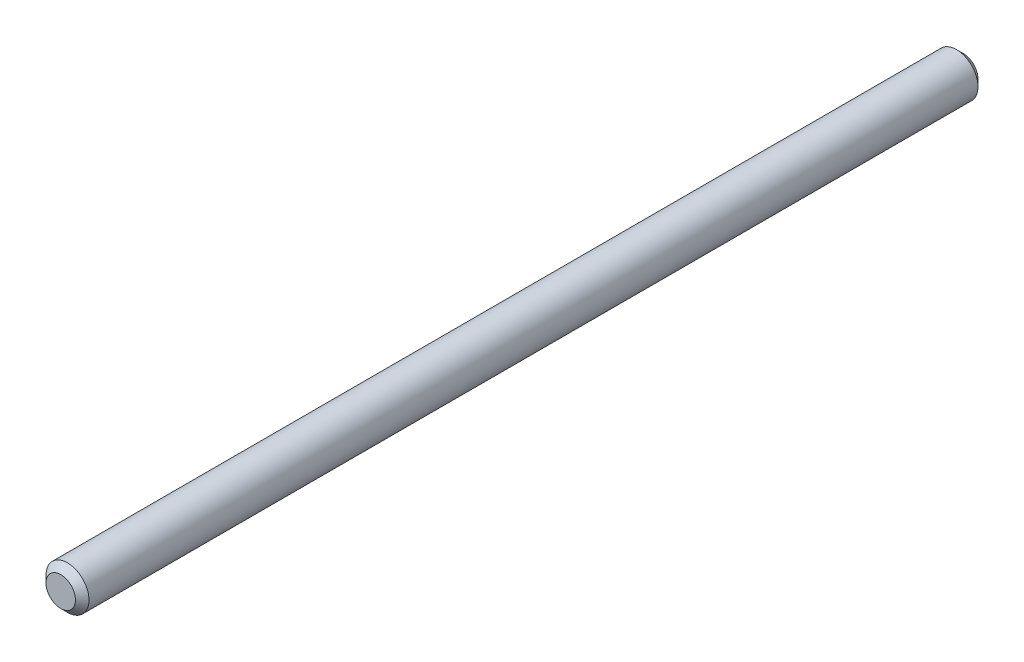
ISO-10303-21;
HEADER;
FILE_DESCRIPTION(('STEP AP214'),'2;1');
FILE_NAME('part.step','',(''),(''),'','','');
FILE_SCHEMA(('AUTOMOTIVE_DESIGN { 1 0 10303 214 1 1 1 1 }'));
ENDSEC;
DATA;
#1=APPLICATION_CONTEXT('core data for automotive mechanical design processes');
#2=APPLICATION_PROTOCOL_DEFINITION('international standard','automotive_design',2000,#1);
#3=PRODUCT_CONTEXT('',#1,'mechanical');
#4=PRODUCT('Part','Part','',(#3));
#5=PRODUCT_RELATED_PRODUCT_CATEGORY('part','',(#4));
#6=PRODUCT_DEFINITION_FORMATION('','',#4);
#7=PRODUCT_DEFINITION_CONTEXT('part definition',#1,'design');
#8=PRODUCT_DEFINITION('design','',#6,#7);
#9=PRODUCT_DEFINITION_SHAPE('','',#8);
#10=(LENGTH_UNIT() NAMED_UNIT(*) SI_UNIT(.MILLI.,.METRE.));
#11=(NAMED_UNIT(*) PLANE_ANGLE_UNIT() SI_UNIT($,.RADIAN.));
#12=(NAMED_UNIT(*) SI_UNIT($,.STERADIAN.) SOLID_ANGLE_UNIT());
#13=UNCERTAINTY_MEASURE_WITH_UNIT(LENGTH_MEASURE(1.E-05),#10,'distance_accuracy_value','');
#14=(GEOMETRIC_REPRESENTATION_CONTEXT(3) GLOBAL_UNCERTAINTY_ASSIGNED_CONTEXT((#13)) GLOBAL_UNIT_ASSIGNED_CONTEXT((#10,
#11,#12)) REPRESENTATION_CONTEXT('',''));
#15=CARTESIAN_POINT('',(0.,0.,0.));
#16=DIRECTION('',(0.,0.,1.));
#17=DIRECTION('',(1.,0.,0.));
#18=AXIS2_PLACEMENT_3D('',#15,#16,#17);
#19=CARTESIAN_POINT('',(0.,0.,100.));
#20=DIRECTION('',(0.,0.,-1.));
#21=DIRECTION('',(-1.,0.,0.));
#22=AXIS2_PLACEMENT_3D('',#19,#20,#21);
#23=CYLINDRICAL_SURFACE('',#22,4.7625);
#24=CARTESIAN_POINT('',(0.,0.,-98.5));
#25=DIRECTION('',(0.,0.,1.));
#26=DIRECTION('',(1.,0.,0.));
#27=AXIS2_PLACEMENT_3D('',#24,#25,#26);
#28=CIRCLE('',#27,4.7625);
#29=CARTESIAN_POINT('',(4.7625,0.,-98.5));
#30=VERTEX_POINT('',#29);
#31=EDGE_CURVE('E48',#30,#30,#28,.T.);
#32=ORIENTED_EDGE('',*,*,#31,.T.);
#33=EDGE_LOOP('',(#32));
#34=FACE_BOUND('',#33,.T.);
#35=CARTESIAN_POINT('',(0.,0.,98.5));
#36=DIRECTION('',(0.,0.,1.));
#37=DIRECTION('',(1.,0.,0.));
#38=AXIS2_PLACEMENT_3D('',#35,#36,#37);
#39=CIRCLE('',#38,4.7625);
#40=CARTESIAN_POINT('',(4.7625,0.,98.5));
#41=VERTEX_POINT('',#40);
#42=EDGE_CURVE('E52',#41,#41,#39,.F.);
#43=ORIENTED_EDGE('',*,*,#42,.T.);
#44=EDGE_LOOP('',(#43));
#45=FACE_BOUND('',#44,.T.);
#46=ADVANCED_FACE('F37',(#34,#45),#23,.T.);
#47=CARTESIAN_POINT('',(0.,0.,100.));
#48=DIRECTION('',(0.,0.,1.));
#49=DIRECTION('',(1.,0.,0.));
#50=AXIS2_PLACEMENT_3D('',#47,#48,#49);
#51=PLANE('',#50);
#52=CARTESIAN_POINT('',(0.,0.,100.));
#53=DIRECTION('',(0.,0.,1.));
#54=DIRECTION('',(1.,0.,0.));
#55=AXIS2_PLACEMENT_3D('',#52,#53,#54);
#56=CIRCLE('',#55,3.2625);
#57=CARTESIAN_POINT('',(3.2625,0.,100.));
#58=VERTEX_POINT('',#57);
#59=EDGE_CURVE('E10',#58,#58,#56,.T.);
#60=ORIENTED_EDGE('',*,*,#59,.T.);
#61=EDGE_LOOP('',(#60));
#62=FACE_BOUND('',#61,.T.);
#63=ADVANCED_FACE('F68',(#62),#51,.T.);
#64=CARTESIAN_POINT('',(0.,0.,-100.));
#65=DIRECTION('',(0.,0.,1.));
#66=DIRECTION('',(1.,0.,0.));
#67=AXIS2_PLACEMENT_3D('',#64,#65,#66);
#68=PLANE('',#67);
#69=CARTESIAN_POINT('',(0.,0.,-100.));
#70=DIRECTION('',(0.,0.,1.));
#71=DIRECTION('',(1.,0.,0.));
#72=AXIS2_PLACEMENT_3D('',#69,#70,#71);
#73=CIRCLE('',#72,3.2625);
#74=CARTESIAN_POINT('',(3.2625,0.,-100.));
#75=VERTEX_POINT('',#74);
#76=EDGE_CURVE('E44',#75,#75,#73,.F.);
#77=ORIENTED_EDGE('',*,*,#76,.T.);
#78=EDGE_LOOP('',(#77));
#79=FACE_BOUND('',#78,.T.);
#80=ADVANCED_FACE('F65',(#79),#68,.F.);
#81=CARTESIAN_POINT('',(0.,0.,-98.5));
#82=DIRECTION('',(0.,0.,1.));
#83=DIRECTION('',(1.,0.,0.));
#84=AXIS2_PLACEMENT_3D('',#81,#82,#83);
#85=CONICAL_SURFACE('',#84,4.7625,0.785398163397447);
#86=ORIENTED_EDGE('',*,*,#76,.F.);
#87=EDGE_LOOP('',(#86));
#88=FACE_BOUND('',#87,.T.);
#89=ORIENTED_EDGE('',*,*,#31,.F.);
#90=EDGE_LOOP('',(#89));
#91=FACE_BOUND('',#90,.T.);
#92=ADVANCED_FACE('F61',(#88,#91),#85,.T.);
#93=CARTESIAN_POINT('',(0.,0.,100.));
#94=DIRECTION('',(0.,0.,-1.));
#95=DIRECTION('',(-1.,0.,0.));
#96=AXIS2_PLACEMENT_3D('',#93,#94,#95);
#97=CONICAL_SURFACE('',#96,3.2625,0.785398163397443);
#98=ORIENTED_EDGE('',*,*,#42,.F.);
#99=EDGE_LOOP('',(#98));
#100=FACE_BOUND('',#99,.T.);
#101=ORIENTED_EDGE('',*,*,#59,.F.);
#102=EDGE_LOOP('',(#101));
#103=FACE_BOUND('',#102,.T.);
#104=ADVANCED_FACE('F39',(#100,#103),#97,.T.);
#105=CLOSED_SHELL('',(#46,#63,#80,#92,#104));
#106=MANIFOLD_SOLID_BREP('B2',#105);
#107=ADVANCED_BREP_SHAPE_REPRESENTATION('',(#18,#106),#14);
#108=SHAPE_DEFINITION_REPRESENTATION(#9,#107);
ENDSEC;
END-ISO-10303-21;
